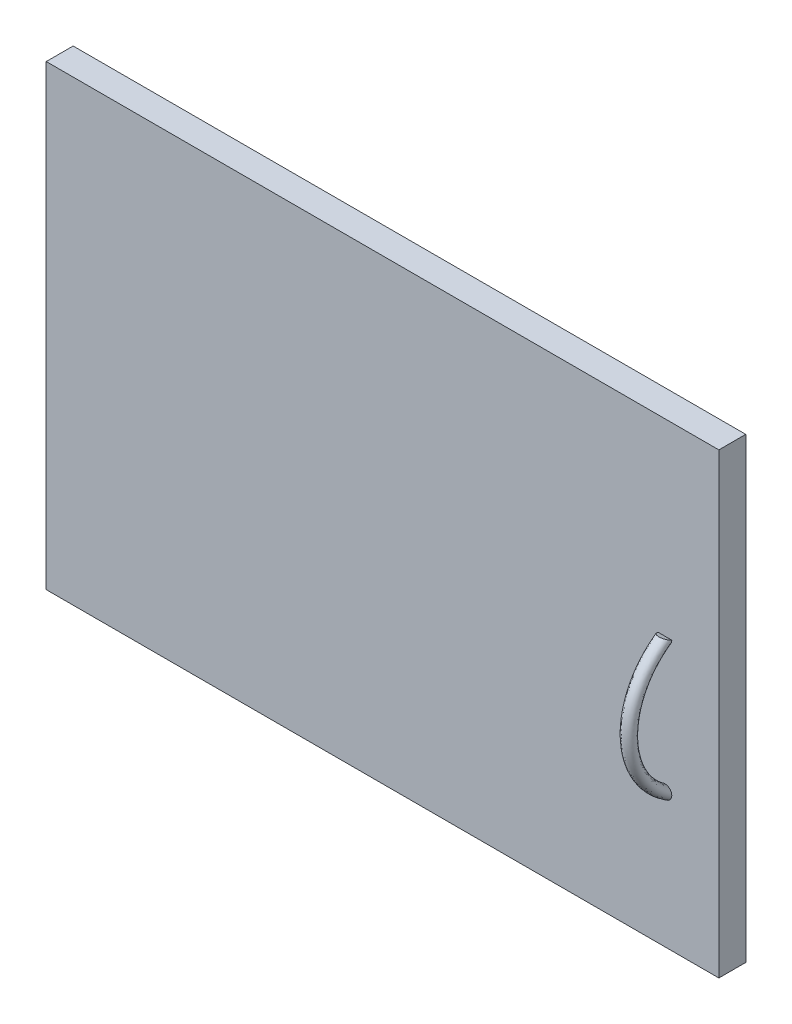
ISO-10303-21;
HEADER;
FILE_DESCRIPTION(('STEP AP214'),'2;1');
FILE_NAME('part.step','',(''),(''),'','','');
FILE_SCHEMA(('AUTOMOTIVE_DESIGN { 1 0 10303 214 1 1 1 1 }'));
ENDSEC;
DATA;
#1=APPLICATION_CONTEXT('core data for automotive mechanical design processes');
#2=APPLICATION_PROTOCOL_DEFINITION('international standard','automotive_design',2000,#1);
#3=PRODUCT_CONTEXT('',#1,'mechanical');
#4=PRODUCT('Part','Part','',(#3));
#5=PRODUCT_RELATED_PRODUCT_CATEGORY('part','',(#4));
#6=PRODUCT_DEFINITION_FORMATION('','',#4);
#7=PRODUCT_DEFINITION_CONTEXT('part definition',#1,'design');
#8=PRODUCT_DEFINITION('design','',#6,#7);
#9=PRODUCT_DEFINITION_SHAPE('','',#8);
#10=(LENGTH_UNIT() NAMED_UNIT(*) SI_UNIT(.MILLI.,.METRE.));
#11=(NAMED_UNIT(*) PLANE_ANGLE_UNIT() SI_UNIT($,.RADIAN.));
#12=(NAMED_UNIT(*) SI_UNIT($,.STERADIAN.) SOLID_ANGLE_UNIT());
#13=UNCERTAINTY_MEASURE_WITH_UNIT(LENGTH_MEASURE(1.E-05),#10,'distance_accuracy_value','');
#14=(GEOMETRIC_REPRESENTATION_CONTEXT(3) GLOBAL_UNCERTAINTY_ASSIGNED_CONTEXT((#13)) GLOBAL_UNIT_ASSIGNED_CONTEXT((#10,
#11,#12)) REPRESENTATION_CONTEXT('',''));
#15=CARTESIAN_POINT('',(0.,0.,0.));
#16=DIRECTION('',(0.,0.,1.));
#17=DIRECTION('',(1.,0.,0.));
#18=AXIS2_PLACEMENT_3D('',#15,#16,#17);
#19=CARTESIAN_POINT('',(12.5,8.5,1.));
#20=DIRECTION('',(-1.,0.,0.));
#21=DIRECTION('',(0.,0.,1.));
#22=AXIS2_PLACEMENT_3D('',#19,#20,#21);
#23=PLANE('',#22);
#24=DIRECTION('',(0.,1.,0.));
#25=VECTOR('',#24,1.);
#26=CARTESIAN_POINT('',(12.5,8.5,0.));
#27=LINE('',#26,#25);
#28=CARTESIAN_POINT('',(12.5,-8.5,0.));
#29=VERTEX_POINT('',#28);
#30=CARTESIAN_POINT('',(12.5,8.5,0.));
#31=VERTEX_POINT('',#30);
#32=EDGE_CURVE('E97',#29,#31,#27,.T.);
#33=ORIENTED_EDGE('',*,*,#32,.T.);
#34=DIRECTION('',(0.,0.,-1.));
#35=VECTOR('',#34,1.);
#36=CARTESIAN_POINT('',(12.5,8.5,1.));
#37=LINE('',#36,#35);
#38=CARTESIAN_POINT('',(12.5,8.5,1.));
#39=VERTEX_POINT('',#38);
#40=EDGE_CURVE('E94',#39,#31,#37,.T.);
#41=ORIENTED_EDGE('',*,*,#40,.F.);
#42=DIRECTION('',(0.,1.,0.));
#43=VECTOR('',#42,1.);
#44=CARTESIAN_POINT('',(12.5,8.5,1.));
#45=LINE('',#44,#43);
#46=CARTESIAN_POINT('',(12.5,-8.5,1.));
#47=VERTEX_POINT('',#46);
#48=EDGE_CURVE('E103',#47,#39,#45,.T.);
#49=ORIENTED_EDGE('',*,*,#48,.F.);
#50=DIRECTION('',(0.,0.,-1.));
#51=VECTOR('',#50,1.);
#52=CARTESIAN_POINT('',(12.5,-8.5,1.));
#53=LINE('',#52,#51);
#54=EDGE_CURVE('E108',#47,#29,#53,.T.);
#55=ORIENTED_EDGE('',*,*,#54,.T.);
#56=EDGE_LOOP('',(#33,#41,#49,#55));
#57=FACE_BOUND('',#56,.T.);
#58=ADVANCED_FACE('F33',(#57),#23,.F.);
#59=CARTESIAN_POINT('',(-12.5,8.5,1.));
#60=DIRECTION('',(0.,-1.,0.));
#61=DIRECTION('',(0.,0.,-1.));
#62=AXIS2_PLACEMENT_3D('',#59,#60,#61);
#63=PLANE('',#62);
#64=DIRECTION('',(-1.,0.,0.));
#65=VECTOR('',#64,1.);
#66=CARTESIAN_POINT('',(-12.5,8.5,0.));
#67=LINE('',#66,#65);
#68=CARTESIAN_POINT('',(-12.5,8.5,0.));
#69=VERTEX_POINT('',#68);
#70=EDGE_CURVE('E100',#31,#69,#67,.T.);
#71=ORIENTED_EDGE('',*,*,#70,.T.);
#72=DIRECTION('',(0.,0.,-1.));
#73=VECTOR('',#72,1.);
#74=CARTESIAN_POINT('',(-12.5,8.5,1.));
#75=LINE('',#74,#73);
#76=CARTESIAN_POINT('',(-12.5,8.5,1.));
#77=VERTEX_POINT('',#76);
#78=EDGE_CURVE('E117',#77,#69,#75,.T.);
#79=ORIENTED_EDGE('',*,*,#78,.F.);
#80=DIRECTION('',(-1.,0.,0.));
#81=VECTOR('',#80,1.);
#82=CARTESIAN_POINT('',(-12.5,8.5,1.));
#83=LINE('',#82,#81);
#84=EDGE_CURVE('E84',#39,#77,#83,.T.);
#85=ORIENTED_EDGE('',*,*,#84,.F.);
#86=ORIENTED_EDGE('',*,*,#40,.T.);
#87=EDGE_LOOP('',(#71,#79,#85,#86));
#88=FACE_BOUND('',#87,.T.);
#89=ADVANCED_FACE('F145',(#88),#63,.F.);
#90=CARTESIAN_POINT('',(-12.5,8.5,1.));
#91=DIRECTION('',(1.,0.,0.));
#92=DIRECTION('',(0.,1.,0.));
#93=AXIS2_PLACEMENT_3D('',#90,#91,#92);
#94=PLANE('',#93);
#95=DIRECTION('',(0.,-1.,0.));
#96=VECTOR('',#95,1.);
#97=CARTESIAN_POINT('',(-12.5,8.5,0.));
#98=LINE('',#97,#96);
#99=CARTESIAN_POINT('',(-12.5,-8.5,0.));
#100=VERTEX_POINT('',#99);
#101=EDGE_CURVE('E111',#69,#100,#98,.T.);
#102=ORIENTED_EDGE('',*,*,#101,.T.);
#103=DIRECTION('',(0.,0.,-1.));
#104=VECTOR('',#103,1.);
#105=CARTESIAN_POINT('',(-12.5,-8.5,1.));
#106=LINE('',#105,#104);
#107=CARTESIAN_POINT('',(-12.5,-8.5,1.));
#108=VERTEX_POINT('',#107);
#109=EDGE_CURVE('E115',#108,#100,#106,.T.);
#110=ORIENTED_EDGE('',*,*,#109,.F.);
#111=DIRECTION('',(0.,-1.,0.));
#112=VECTOR('',#111,1.);
#113=CARTESIAN_POINT('',(-12.5,8.5,1.));
#114=LINE('',#113,#112);
#115=EDGE_CURVE('E106',#77,#108,#114,.T.);
#116=ORIENTED_EDGE('',*,*,#115,.F.);
#117=ORIENTED_EDGE('',*,*,#78,.T.);
#118=EDGE_LOOP('',(#102,#110,#116,#117));
#119=FACE_BOUND('',#118,.T.);
#120=ADVANCED_FACE('F150',(#119),#94,.F.);
#121=CARTESIAN_POINT('',(-12.5,-8.5,1.));
#122=DIRECTION('',(0.,1.,0.));
#123=DIRECTION('',(0.,0.,1.));
#124=AXIS2_PLACEMENT_3D('',#121,#122,#123);
#125=PLANE('',#124);
#126=DIRECTION('',(1.,0.,0.));
#127=VECTOR('',#126,1.);
#128=CARTESIAN_POINT('',(-12.5,-8.5,0.));
#129=LINE('',#128,#127);
#130=EDGE_CURVE('E76',#100,#29,#129,.T.);
#131=ORIENTED_EDGE('',*,*,#130,.T.);
#132=ORIENTED_EDGE('',*,*,#54,.F.);
#133=DIRECTION('',(1.,0.,0.));
#134=VECTOR('',#133,1.);
#135=CARTESIAN_POINT('',(-12.5,-8.5,1.));
#136=LINE('',#135,#134);
#137=EDGE_CURVE('E55',#108,#47,#136,.T.);
#138=ORIENTED_EDGE('',*,*,#137,.F.);
#139=ORIENTED_EDGE('',*,*,#109,.T.);
#140=EDGE_LOOP('',(#131,#132,#138,#139));
#141=FACE_BOUND('',#140,.T.);
#142=ADVANCED_FACE('F159',(#141),#125,.F.);
#143=CARTESIAN_POINT('',(0.,0.,1.));
#144=DIRECTION('',(0.,0.,1.));
#145=DIRECTION('',(1.,0.,0.));
#146=AXIS2_PLACEMENT_3D('',#143,#144,#145);
#147=PLANE('',#146);
#148=CARTESIAN_POINT('',(10.5,-3.5,1.));
#149=DIRECTION('',(0.,0.,1.));
#150=DIRECTION('',(1.,0.,0.));
#151=AXIS2_PLACEMENT_3D('',#148,#149,#150);
#152=CIRCLE('',#151,0.25);
#153=CARTESIAN_POINT('',(10.75,-3.5,1.));
#154=VERTEX_POINT('',#153);
#155=EDGE_CURVE('E11',#154,#154,#152,.T.);
#156=ORIENTED_EDGE('',*,*,#155,.F.);
#157=EDGE_LOOP('',(#156));
#158=FACE_BOUND('',#157,.T.);
#159=DIRECTION('',(-1.,0.,0.));
#160=VECTOR('',#159,1.);
#161=CARTESIAN_POINT('',(0.,1.5,1.));
#162=LINE('',#161,#160);
#163=CARTESIAN_POINT('',(10.75,1.5,1.));
#164=VERTEX_POINT('',#163);
#165=CARTESIAN_POINT('',(10.25,1.4999999999996,1.));
#166=VERTEX_POINT('',#165);
#167=EDGE_CURVE('E40',#164,#166,#162,.T.);
#168=ORIENTED_EDGE('',*,*,#167,.F.);
#169=CARTESIAN_POINT('',(10.25,1.4999999999996,1.));
#170=CARTESIAN_POINT('',(10.2499849383462,1.48521380831301,1.));
#171=CARTESIAN_POINT('',(10.2513107879814,1.47043090602272,1.));
#172=CARTESIAN_POINT('',(10.2565342684534,1.44134485033556,1.));
#173=CARTESIAN_POINT('',(10.2604287156994,1.42704112606338,1.));
#174=CARTESIAN_POINT('',(10.2704349955121,1.40000922152133,1.));
#175=CARTESIAN_POINT('',(10.2764320160511,1.38723841818463,1.));
#176=CARTESIAN_POINT('',(10.2904825810203,1.36288754550715,1.));
#177=CARTESIAN_POINT('',(10.2985355428519,1.35130714014124,1.));
#178=CARTESIAN_POINT('',(10.3164662379724,1.32966876791736,1.));
#179=CARTESIAN_POINT('',(10.3263429504422,1.31960995507084,1.));
#180=CARTESIAN_POINT('',(10.3476589094819,1.30127896220532,1.));
#181=CARTESIAN_POINT('',(10.3591003242637,1.2930093032142,1.));
#182=CARTESIAN_POINT('',(10.3831932114465,1.27851971922292,1.));
#183=CARTESIAN_POINT('',(10.3958430021192,1.2722969975675,1.));
#184=CARTESIAN_POINT('',(10.4220250251267,1.2620551260108,1.));
#185=CARTESIAN_POINT('',(10.4355584238193,1.2580389573408,1.));
#186=CARTESIAN_POINT('',(10.4630982543969,1.25233921796588,1.));
#187=CARTESIAN_POINT('',(10.4771043618048,1.25065407925999,1.));
#188=CARTESIAN_POINT('',(10.5052006918618,1.24965913010081,1.));
#189=CARTESIAN_POINT('',(10.5192909145128,1.25034931970049,1.));
#190=CARTESIAN_POINT('',(10.5471649338561,1.25408673860878,1.));
#191=CARTESIAN_POINT('',(10.5609485178429,1.25713555460836,1.));
#192=CARTESIAN_POINT('',(10.5877894183578,1.26549977698984,1.));
#193=CARTESIAN_POINT('',(10.6008476872816,1.27081212763867,1.));
#194=CARTESIAN_POINT('',(10.6259051598728,1.28356118255447,1.));
#195=CARTESIAN_POINT('',(10.6379028843724,1.29100079442046,1.));
#196=CARTESIAN_POINT('',(10.6604620598936,1.30777811884476,1.));
#197=CARTESIAN_POINT('',(10.6710254944948,1.31711316452531,1.));
#198=CARTESIAN_POINT('',(10.6904502594716,1.3374374474221,0.999999999999999));
#199=CARTESIAN_POINT('',(10.6993091763776,1.348428991441,0.999999999999997));
#200=CARTESIAN_POINT('',(10.7150431990228,1.37172799978713,1.));
#201=CARTESIAN_POINT('',(10.7219210843864,1.38403358677109,1.00000000000001));
#202=CARTESIAN_POINT('',(10.7335244640276,1.40964299397018,0.999999999999988));
#203=CARTESIAN_POINT('',(10.7382465667954,1.42294834900592,0.999999999999956));
#204=CARTESIAN_POINT('',(10.7453800964998,1.45014517930887,1.00000000000004));
#205=CARTESIAN_POINT('',(10.7477954860292,1.46403560648079,1.00000000000016));
#206=CARTESIAN_POINT('',(10.7496782736988,1.48533103875345,0.999999999999826));
#207=CARTESIAN_POINT('',(10.7500024341253,1.49266762535787,0.999999999999619));
#208=CARTESIAN_POINT('',(10.75,1.49999999999984,0.99999999999926));
#209=B_SPLINE_CURVE_WITH_KNOTS('',3,(#169,#170,#171,#172,#173,#174,#175,#176,#177,#178,#179,
#180,#181,#182,#183,#184,#185,#186,#187,#188,#189,#190,#191,#192,#193,#194,#195,#196,#197,#198,
#199,#200,#201,#202,#203,#204,#205,#206,#207,#208),.UNSPECIFIED.,.F.,.F.,(4,2,2,2,2,2,2,2,2,2,2,
2,2,2,2,2,2,2,2,4),(0.,0.0442952865142491,0.0885357751367137,0.130662886941268,
0.172778074274134,0.21486975927934,0.257020373261495,0.299113156873601,0.341262672254035,
0.383383821344407,0.425504971374236,0.467654481735632,0.509747270365628,0.551897869871191,
0.593989569352211,0.636140435884232,0.678231868338641,0.720389293392309,0.762474167249239,
0.784475293763795),.UNSPECIFIED.);
#210=EDGE_CURVE('E46',#166,#164,#209,.T.);
#211=ORIENTED_EDGE('',*,*,#210,.F.);
#212=EDGE_LOOP('',(#168,#211));
#213=FACE_BOUND('',#212,.T.);
#214=ORIENTED_EDGE('',*,*,#48,.T.);
#215=ORIENTED_EDGE('',*,*,#84,.T.);
#216=ORIENTED_EDGE('',*,*,#115,.T.);
#217=ORIENTED_EDGE('',*,*,#137,.T.);
#218=EDGE_LOOP('',(#214,#215,#216,#217));
#219=FACE_BOUND('',#218,.T.);
#220=ADVANCED_FACE('F86',(#158,#213,#219),#147,.T.);
#221=CARTESIAN_POINT('',(0.,0.,0.));
#222=DIRECTION('',(0.,0.,1.));
#223=DIRECTION('',(1.,0.,0.));
#224=AXIS2_PLACEMENT_3D('',#221,#222,#223);
#225=PLANE('',#224);
#226=ORIENTED_EDGE('',*,*,#32,.F.);
#227=ORIENTED_EDGE('',*,*,#130,.F.);
#228=ORIENTED_EDGE('',*,*,#101,.F.);
#229=ORIENTED_EDGE('',*,*,#70,.F.);
#230=EDGE_LOOP('',(#226,#227,#228,#229));
#231=FACE_BOUND('',#230,.T.);
#232=ADVANCED_FACE('F133',(#231),#225,.F.);
#233=CARTESIAN_POINT('',(10.5,1.5,1.));
#234=DIRECTION('',(0.,0.921284663987611,-0.388888888888889));
#235=DIRECTION('',(1.,0.,0.));
#236=AXIS2_PLACEMENT_3D('',#233,#234,#235);
#237=PLANE('',#236);
#238=CARTESIAN_POINT('',(10.5,1.5,1.));
#239=DIRECTION('',(0.,0.921284663987611,-0.388888888888889));
#240=DIRECTION('',(1.,0.,0.));
#241=AXIS2_PLACEMENT_3D('',#238,#239,#240);
#242=CIRCLE('',#241,0.25);
#243=EDGE_CURVE('E93',#166,#164,#242,.T.);
#244=ORIENTED_EDGE('',*,*,#243,.T.);
#245=ORIENTED_EDGE('',*,*,#167,.T.);
#246=EDGE_LOOP('',(#244,#245));
#247=FACE_BOUND('',#246,.T.);
#248=ADVANCED_FACE('F96',(#247),#237,.T.);
#249=CARTESIAN_POINT('',(10.75,-3.5,1.));
#250=CARTESIAN_POINT('',(10.75,-2.18734296383275,2.97890493972125));
#251=CARTESIAN_POINT('',(10.75,0.187342963832745,2.97890493972125));
#252=CARTESIAN_POINT('',(10.75,1.5,1.));
#253=CARTESIAN_POINT('',(10.75,-3.,1.));
#254=CARTESIAN_POINT('',(10.75,-1.68734296383275,2.583123951777));
#255=CARTESIAN_POINT('',(10.75,0.357525473879203,2.36434777908246));
#256=CARTESIAN_POINT('',(10.75,1.30555555555555,0.539357668006196));
#257=CARTESIAN_POINT('',(10.25,-3.,1.));
#258=CARTESIAN_POINT('',(10.25,-1.68734296383275,2.583123951777));
#259=CARTESIAN_POINT('',(10.25,0.357525473879203,2.36434777908246));
#260=CARTESIAN_POINT('',(10.25,1.30555555555555,0.539357668006196));
#261=CARTESIAN_POINT('',(10.25,-3.5,1.));
#262=CARTESIAN_POINT('',(10.25,-2.18734296383275,2.97890493972125));
#263=CARTESIAN_POINT('',(10.25,0.187342963832745,2.97890493972125));
#264=CARTESIAN_POINT('',(10.25,1.5,1.));
#265=CARTESIAN_POINT('',(10.25,-4.,1.));
#266=CARTESIAN_POINT('',(10.25,-2.68734296383275,3.3746859276655));
#267=CARTESIAN_POINT('',(10.25,0.0171604537862876,3.59346210036004));
#268=CARTESIAN_POINT('',(10.25,1.69444444444444,1.4606423319938));
#269=CARTESIAN_POINT('',(10.75,-4.,1.));
#270=CARTESIAN_POINT('',(10.75,-2.68734296383275,3.3746859276655));
#271=CARTESIAN_POINT('',(10.75,0.0171604537862876,3.59346210036004));
#272=CARTESIAN_POINT('',(10.75,1.69444444444444,1.4606423319938));
#273=CARTESIAN_POINT('',(10.75,-3.5,1.));
#274=CARTESIAN_POINT('',(10.75,-2.18734296383275,2.97890493972125));
#275=CARTESIAN_POINT('',(10.75,0.187342963832745,2.97890493972125));
#276=CARTESIAN_POINT('',(10.75,1.5,1.));
#277=(BOUNDED_SURFACE() B_SPLINE_SURFACE(3,3,((#249,#250,#251,#252),(#253,#254,#255,#256),(#257,
#258,#259,#260),(#261,#262,#263,#264),(#265,#266,#267,#268),(#269,#270,#271,#272),(#273,#274,
#275,#276)),.UNSPECIFIED.,.T.,.F.,.F.) B_SPLINE_SURFACE_WITH_KNOTS((4,3,4),(4,4),(0.,0.5,1.),
(0.,1.),.UNSPECIFIED.) GEOMETRIC_REPRESENTATION_ITEM() RATIONAL_B_SPLINE_SURFACE(((1.,
0.701847198928378,0.701847198928378,1.),(0.333333333333333,0.233949066309459,0.233949066309459,
0.333333333333333),(0.333333333333333,0.233949066309459,0.233949066309459,0.333333333333333),
(1.,0.701847198928378,0.701847198928378,1.),(0.333333333333333,0.233949066309459,
0.233949066309459,0.333333333333333),(0.333333333333333,0.233949066309459,0.233949066309459,
0.333333333333333),(1.,0.701847198928378,0.701847198928378,1.))) REPRESENTATION_ITEM('') SURFACE());
#278=ORIENTED_EDGE('',*,*,#243,.F.);
#279=ORIENTED_EDGE('',*,*,#210,.T.);
#280=EDGE_LOOP('',(#278,#279));
#281=FACE_BOUND('',#280,.T.);
#282=ORIENTED_EDGE('',*,*,#155,.T.);
#283=EDGE_LOOP('',(#282));
#284=FACE_BOUND('',#283,.T.);
#285=ADVANCED_FACE('F91',(#281,#284),#277,.T.);
#286=CLOSED_SHELL('',(#58,#89,#120,#142,#220,#232,#248,#285));
#287=MANIFOLD_SOLID_BREP('B2',#286);
#288=ADVANCED_BREP_SHAPE_REPRESENTATION('',(#18,#287),#14);
#289=SHAPE_DEFINITION_REPRESENTATION(#9,#288);
ENDSEC;
END-ISO-10303-21;
